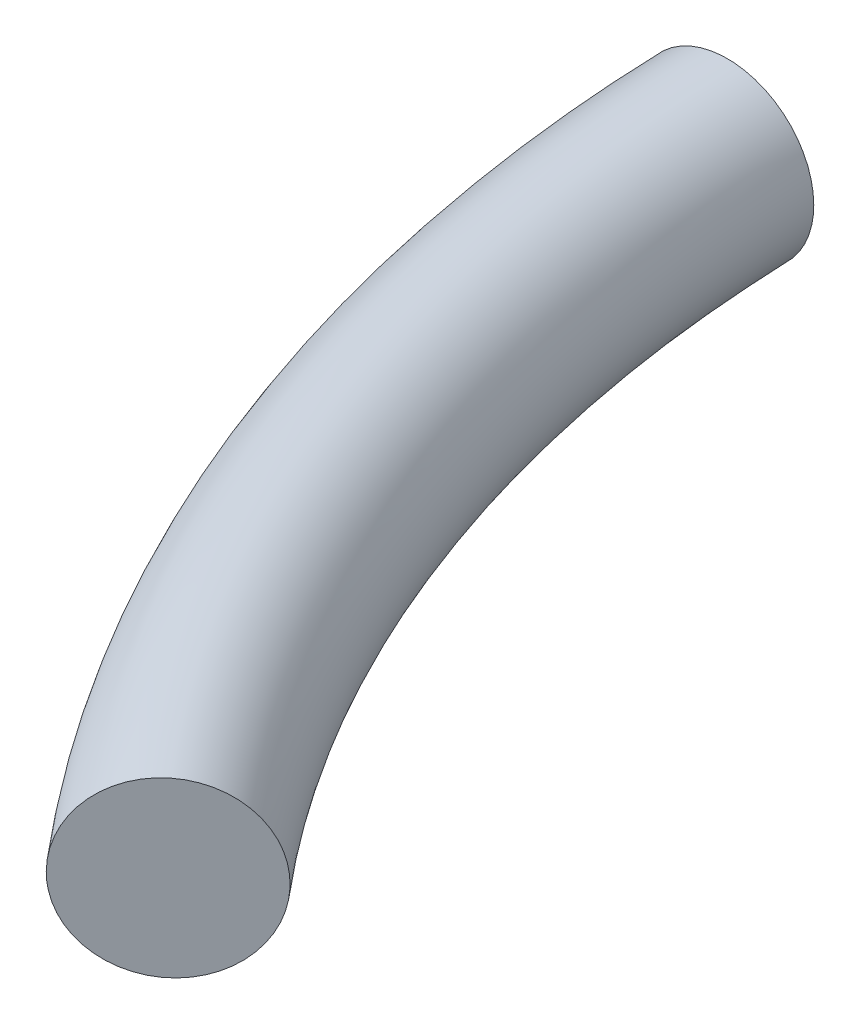
ISO-10303-21;
HEADER;
FILE_DESCRIPTION(('STEP AP214'),'2;1');
FILE_NAME('part.step','',(''),(''),'','','');
FILE_SCHEMA(('AUTOMOTIVE_DESIGN { 1 0 10303 214 1 1 1 1 }'));
ENDSEC;
DATA;
#1=APPLICATION_CONTEXT('core data for automotive mechanical design processes');
#2=APPLICATION_PROTOCOL_DEFINITION('international standard','automotive_design',2000,#1);
#3=PRODUCT_CONTEXT('',#1,'mechanical');
#4=PRODUCT('Part','Part','',(#3));
#5=PRODUCT_RELATED_PRODUCT_CATEGORY('part','',(#4));
#6=PRODUCT_DEFINITION_FORMATION('','',#4);
#7=PRODUCT_DEFINITION_CONTEXT('part definition',#1,'design');
#8=PRODUCT_DEFINITION('design','',#6,#7);
#9=PRODUCT_DEFINITION_SHAPE('','',#8);
#10=(LENGTH_UNIT() NAMED_UNIT(*) SI_UNIT(.MILLI.,.METRE.));
#11=(NAMED_UNIT(*) PLANE_ANGLE_UNIT() SI_UNIT($,.RADIAN.));
#12=(NAMED_UNIT(*) SI_UNIT($,.STERADIAN.) SOLID_ANGLE_UNIT());
#13=UNCERTAINTY_MEASURE_WITH_UNIT(LENGTH_MEASURE(1.E-05),#10,'distance_accuracy_value','');
#14=(GEOMETRIC_REPRESENTATION_CONTEXT(3) GLOBAL_UNCERTAINTY_ASSIGNED_CONTEXT((#13)) GLOBAL_UNIT_ASSIGNED_CONTEXT((#10,
#11,#12)) REPRESENTATION_CONTEXT('',''));
#15=CARTESIAN_POINT('',(0.,0.,0.));
#16=DIRECTION('',(0.,0.,1.));
#17=DIRECTION('',(1.,0.,0.));
#18=AXIS2_PLACEMENT_3D('',#15,#16,#17);
#19=CARTESIAN_POINT('',(0.,6.,0.));
#20=DIRECTION('',(0.642787609686505,0.,0.766044443119007));
#21=DIRECTION('',(0.766044443119007,0.,-0.642787609686505));
#22=AXIS2_PLACEMENT_3D('',#19,#20,#21);
#23=PLANE('',#22);
#24=CARTESIAN_POINT('',(-5.56314943222272,0.7302,4.66803663676176));
#25=CARTESIAN_POINT('',(-5.56314801835112,0.75265524155964,4.66803545038262));
#26=CARTESIAN_POINT('',(-5.56169559657985,0.775130857259379,4.66681672381004));
#27=CARTESIAN_POINT('',(-5.55591739134539,0.819482451297505,4.66196823392893));
#28=CARTESIAN_POINT('',(-5.55158545824048,0.841357041711003,4.65833331045832));
#29=CARTESIAN_POINT('',(-5.54017728754368,0.883809618347233,4.64876071863422));
#30=CARTESIAN_POINT('',(-5.53310594805307,0.904389843003348,4.64282716027573));
#31=CARTESIAN_POINT('',(-5.51640657955334,0.943737337222424,4.62881472632671));
#32=CARTESIAN_POINT('',(-5.50677492359407,0.962501982989582,4.62073280736366));
#33=CARTESIAN_POINT('',(-5.48524883923675,0.997627484938171,4.60267027791875));
#34=CARTESIAN_POINT('',(-5.47335762063846,1.01399169330263,4.59269236077867));
#35=CARTESIAN_POINT('',(-5.44762249830115,1.0439048849067,4.57109802911713));
#36=CARTESIAN_POINT('',(-5.43377588429877,1.05744989503907,4.55947934041469));
#37=CARTESIAN_POINT('',(-5.40454698224069,1.08130194187445,4.53495337947803));
#38=CARTESIAN_POINT('',(-5.38916582005334,1.0916113298001,4.52204705195956));
#39=CARTESIAN_POINT('',(-5.35729500603692,1.10871348302438,4.49530426367306));
#40=CARTESIAN_POINT('',(-5.34080528905904,1.11550604143746,4.4814677482387));
#41=CARTESIAN_POINT('',(-5.3071868157276,1.12538061292917,4.45325849966555));
#42=CARTESIAN_POINT('',(-5.29005807818154,1.12846273512374,4.43888578230812));
#43=CARTESIAN_POINT('',(-5.25564733500628,1.1308293161772,4.41001174040123));
#44=CARTESIAN_POINT('',(-5.23836532937709,1.13011377503607,4.39551041585177));
#45=CARTESIAN_POINT('',(-5.20413812474646,1.12490525493437,4.36679038106998));
#46=CARTESIAN_POINT('',(-5.18719293566527,1.12041216488209,4.35257167916173));
#47=CARTESIAN_POINT('',(-5.15412194121603,1.10777635092602,4.32482181991671));
#48=CARTESIAN_POINT('',(-5.13799608771281,1.09963384169881,4.31129062218973));
#49=CARTESIAN_POINT('',(-5.10700905643696,1.07992311451522,4.28528941567489));
#50=CARTESIAN_POINT('',(-5.09214880904155,1.06835240391896,4.27282018756621));
#51=CARTESIAN_POINT('',(-5.0641483327315,1.04213485030234,4.24932499822166));
#52=CARTESIAN_POINT('',(-5.05100572836706,1.02749233015651,4.23829704374674));
#53=CARTESIAN_POINT('',(-5.02677143143803,0.99551397474831,4.21796205413176));
#54=CARTESIAN_POINT('',(-5.01568266107474,0.97817436557765,4.20865747100972));
#55=CARTESIAN_POINT('',(-4.9959085162887,0.941335318357767,4.1920649934129));
#56=CARTESIAN_POINT('',(-4.9872197461931,0.921838987081608,4.1847742496303));
#57=CARTESIAN_POINT('',(-4.97245756828957,0.881186262625342,4.17238731159608));
#58=CARTESIAN_POINT('',(-4.96638885128787,0.860026971539701,4.16729505339823));
#59=CARTESIAN_POINT('',(-4.95707261308493,0.81671349003598,4.15947780135819));
#60=CARTESIAN_POINT('',(-4.95381908800493,0.794561523394872,4.15674776966353));
#61=CARTESIAN_POINT('',(-4.95087926015648,0.758269762147005,4.15428096120017));
#62=CARTESIAN_POINT('',(-4.9503129937847,0.744238862857464,4.15380580729646));
#63=CARTESIAN_POINT('',(-4.95031529159912,0.70774475844036,4.1538077353917));
#64=CARTESIAN_POINT('',(-4.95176771337039,0.685269142740621,4.15502646196428));
#65=CARTESIAN_POINT('',(-4.95754591860485,0.640917548702496,4.15987495184539));
#66=CARTESIAN_POINT('',(-4.96187785170976,0.619042958288997,4.163509875316));
#67=CARTESIAN_POINT('',(-4.97328602240656,0.576590381652767,4.17308246714009));
#68=CARTESIAN_POINT('',(-4.98035736189717,0.556010156996652,4.17901602549859));
#69=CARTESIAN_POINT('',(-4.9970567303969,0.516662662777576,4.19302845944761));
#70=CARTESIAN_POINT('',(-5.00668838635617,0.497898017010418,4.20111037841065));
#71=CARTESIAN_POINT('',(-5.02821447071349,0.46277251506183,4.21917290785557));
#72=CARTESIAN_POINT('',(-5.04010568931179,0.44640830669737,4.22915082499565));
#73=CARTESIAN_POINT('',(-5.06584081164909,0.416495115093302,4.25074515665718));
#74=CARTESIAN_POINT('',(-5.07968742565147,0.40295010496093,4.26236384535963));
#75=CARTESIAN_POINT('',(-5.10891632770956,0.379098058125553,4.28688980629628));
#76=CARTESIAN_POINT('',(-5.1242974898969,0.368788670199896,4.29979613381476));
#77=CARTESIAN_POINT('',(-5.15616830391332,0.351686516975622,4.32653892210126));
#78=CARTESIAN_POINT('',(-5.1726580208912,0.344893958562538,4.34037543753561));
#79=CARTESIAN_POINT('',(-5.20627649422264,0.335019387070832,4.36858468610877));
#80=CARTESIAN_POINT('',(-5.22340523176871,0.331937264876257,4.3829574034662));
#81=CARTESIAN_POINT('',(-5.25781597494396,0.329570683822803,4.41183144537309));
#82=CARTESIAN_POINT('',(-5.27509798057316,0.330286224963925,4.42633276992255));
#83=CARTESIAN_POINT('',(-5.30932518520378,0.335494745065634,4.45505280470433));
#84=CARTESIAN_POINT('',(-5.32627037428497,0.339987835117909,4.46927150661259));
#85=CARTESIAN_POINT('',(-5.35934136873421,0.352623649073977,4.49702136585761));
#86=CARTESIAN_POINT('',(-5.37546722223743,0.360766158301187,4.51055256358458));
#87=CARTESIAN_POINT('',(-5.40645425351329,0.380476885484782,4.53655377009943));
#88=CARTESIAN_POINT('',(-5.42131450090869,0.392047596081043,4.54902299820811));
#89=CARTESIAN_POINT('',(-5.44931497721874,0.418265149697662,4.57251818755266));
#90=CARTESIAN_POINT('',(-5.46245758158318,0.432907669843492,4.58354614202757));
#91=CARTESIAN_POINT('',(-5.48669187851221,0.46488602525169,4.60388113164256));
#92=CARTESIAN_POINT('',(-5.4977806488755,0.482225634422349,4.6131857147646));
#93=CARTESIAN_POINT('',(-5.51755479366154,0.519064681642232,4.62977819236142));
#94=CARTESIAN_POINT('',(-5.52624356375714,0.538561012918391,4.63706893614402));
#95=CARTESIAN_POINT('',(-5.54100574166067,0.579213737374656,4.64945587417824));
#96=CARTESIAN_POINT('',(-5.54707445866237,0.600373028460299,4.65454813237609));
#97=CARTESIAN_POINT('',(-5.55639069686531,0.64368650996402,4.66236538441613));
#98=CARTESIAN_POINT('',(-5.55964422194531,0.665838476605128,4.66509541611079));
#99=CARTESIAN_POINT('',(-5.56258404979376,0.702130237852995,4.66756222457415));
#100=CARTESIAN_POINT('',(-5.56315031616555,0.716161137142536,4.66803737847786));
#101=CARTESIAN_POINT('',(-5.56314943222272,0.7302,4.66803663676176));
#102=B_SPLINE_CURVE_WITH_KNOTS('',3,(#24,#25,#26,#27,#28,#29,#30,#31,#32,#33,#34,#35,#36,#37,
#38,#39,#40,#41,#42,#43,#44,#45,#46,#47,#48,#49,#50,#51,#52,#53,#54,#55,#56,#57,#58,#59,#60,#61,
#62,#63,#64,#65,#66,#67,#68,#69,#70,#71,#72,#73,#74,#75,#76,#77,#78,#79,#80,#81,#82,#83,#84,#85,
#86,#87,#88,#89,#90,#91,#92,#93,#94,#95,#96,#97,#98,#99,#100,#101),.UNSPECIFIED.,.T.,.F.,(4,2,2,
2,2,2,2,2,2,2,2,2,2,2,2,2,2,2,2,2,2,2,2,2,2,2,2,2,2,2,2,2,2,2,2,2,2,2,4),(0.,0.0673217190940752,
0.134787678055461,0.202133559490899,0.269575356418626,0.336922056232695,0.40436303479347,
0.471754892083667,0.539150713403565,0.606544552708821,0.673938392014079,0.741334213333976,
0.808726070624175,0.876167049184948,0.943513748999018,1.01095554592846,1.07830142736561,
1.14576738632871,1.2130891054245,1.25517818200736,1.32249990110144,1.38996586006282,
1.45731174149826,1.52475353842599,1.59210023824006,1.65954121680083,1.72693307409103,
1.79432889541093,1.86172273471618,1.92911657402144,1.99651239534134,2.06390425263154,
2.13134523119231,2.19869193100638,2.26613372793582,2.33347960937297,2.40094556833607,
2.46826728743186,2.51035636401472),.UNSPECIFIED.);
#103=CARTESIAN_POINT('',(-5.56314943222272,0.7302,4.66803663676176));
#104=VERTEX_POINT('',#103);
#105=EDGE_CURVE('E18',#104,#104,#102,.T.);
#106=ORIENTED_EDGE('',*,*,#105,.F.);
#107=EDGE_LOOP('',(#106));
#108=FACE_BOUND('',#107,.T.);
#109=ADVANCED_FACE('F14',(#108),#23,.T.);
#110=CARTESIAN_POINT('',(0.,6.,0.));
#111=DIRECTION('',(0.0348994967024999,0.,0.999390827019096));
#112=DIRECTION('',(0.999390827019096,0.,-0.0348994967024999));
#113=AXIS2_PLACEMENT_3D('',#110,#111,#112);
#114=PLANE('',#113);
#115=CARTESIAN_POINT('',(-6.45823923756032,0.7302,0.225526683737396));
#116=CARTESIAN_POINT('',(-6.45824108211428,0.75265524155964,0.225526748150638));
#117=CARTESIAN_POINT('',(-6.46013592908851,0.775130857259379,0.22559291766505));
#118=CARTESIAN_POINT('',(-6.46767424538311,0.819482451297505,0.22585616147073));
#119=CARTESIAN_POINT('',(-6.4733257376003,0.841357041711003,0.226053515927727));
#120=CARTESIAN_POINT('',(-6.48820897479347,0.883809618347233,0.226573250023041));
#121=CARTESIAN_POINT('',(-6.49743432964739,0.904389843003348,0.226895406513378));
#122=CARTESIAN_POINT('',(-6.51922052736159,0.943737337222424,0.227656197301856));
#123=CARTESIAN_POINT('',(-6.53178610198478,0.962501982989582,0.2280949968368));
#124=CARTESIAN_POINT('',(-6.55986929146756,0.997627484938171,0.229075683423321));
#125=CARTESIAN_POINT('',(-6.57538271878364,1.01399169330263,0.229617424242657));
#126=CARTESIAN_POINT('',(-6.60895707002024,1.0439048849067,0.230789866423026));
#127=CARTESIAN_POINT('',(-6.62702152978305,1.05744989503907,0.231420691258393));
#128=CARTESIAN_POINT('',(-6.66515390821498,1.08130194187445,0.232752303255786));
#129=CARTESIAN_POINT('',(-6.68522035806264,1.09161132980011,0.233453039125437));
#130=CARTESIAN_POINT('',(-6.72679940672456,1.10871348302438,0.234905011499447));
#131=CARTESIAN_POINT('',(-6.74831209053275,1.11550604143746,0.23565625097186));
#132=CARTESIAN_POINT('',(-6.79217115663214,1.12538061292917,0.23718784330924));
#133=CARTESIAN_POINT('',(-6.81451751438686,1.12846273512374,0.237968195317374));
#134=CARTESIAN_POINT('',(-6.85941018528757,1.1308293161772,0.239535881929766));
#135=CARTESIAN_POINT('',(-6.88195649843357,1.13011377503608,0.240323216534023));
#136=CARTESIAN_POINT('',(-6.92660972273355,1.12490525493437,0.241882541486866));
#137=CARTESIAN_POINT('',(-6.94871662094549,1.12041216488209,0.242654531383505));
#138=CARTESIAN_POINT('',(-6.99186143948682,1.10777635092602,0.244161181646551));
#139=CARTESIAN_POINT('',(-7.01289942261396,1.09963384169881,0.244895844205904));
#140=CARTESIAN_POINT('',(-7.05332547764486,1.07992311451522,0.246307553155098));
#141=CARTESIAN_POINT('',(-7.07271233576725,1.06835240391895,0.246984557158762));
#142=CARTESIAN_POINT('',(-7.1092420951406,1.04213485030234,0.248260204465426));
#143=CARTESIAN_POINT('',(-7.12638809543203,1.02749233015651,0.248858955989305));
#144=CARTESIAN_POINT('',(-7.1580044517253,0.995513974748309,0.249963023479592));
#145=CARTESIAN_POINT('',(-7.17247099538805,0.978174365577649,0.250468206316185));
#146=CARTESIAN_POINT('',(-7.19826858335939,0.941335318357766,0.251369077939174));
#147=CARTESIAN_POINT('',(-7.20960405770376,0.921838987081608,0.251764921425829));
#148=CARTESIAN_POINT('',(-7.22886297318331,0.881186262625343,0.252437457573951));
#149=CARTESIAN_POINT('',(-7.23678029463607,0.8600269715397,0.252713936531399));
#150=CARTESIAN_POINT('',(-7.24893437144712,0.816713490035979,0.253138366246105));
#151=CARTESIAN_POINT('',(-7.2531789595381,0.794561523394871,0.253286590528417));
#152=CARTESIAN_POINT('',(-7.25701429443434,0.758269762147004,0.253420523374249));
#153=CARTESIAN_POINT('',(-7.25775305237807,0.744238862857464,0.253446321370112));
#154=CARTESIAN_POINT('',(-7.25775005462163,0.70774475844036,0.25344621668615));
#155=CARTESIAN_POINT('',(-7.25585520764741,0.685269142740622,0.253380047171744));
#156=CARTESIAN_POINT('',(-7.2483168913528,0.640917548702496,0.253116803366065));
#157=CARTESIAN_POINT('',(-7.24266539913562,0.619042958288997,0.252919448909062));
#158=CARTESIAN_POINT('',(-7.22778216194244,0.576590381652767,0.252399714813748));
#159=CARTESIAN_POINT('',(-7.21855680708852,0.556010156996652,0.252077558323417));
#160=CARTESIAN_POINT('',(-7.19677060937433,0.516662662777576,0.251316767534938));
#161=CARTESIAN_POINT('',(-7.18420503475114,0.497898017010418,0.250877967999987));
#162=CARTESIAN_POINT('',(-7.15612184526835,0.46277251506183,0.249897281413466));
#163=CARTESIAN_POINT('',(-7.14060841795227,0.44640830669737,0.249355540594137));
#164=CARTESIAN_POINT('',(-7.10703406671568,0.416495115093302,0.248183098413769));
#165=CARTESIAN_POINT('',(-7.08896960695286,0.40295010496093,0.247552273578396));
#166=CARTESIAN_POINT('',(-7.05083722852094,0.379098058125553,0.246220661581003));
#167=CARTESIAN_POINT('',(-7.03077077867327,0.368788670199896,0.245519925711358));
#168=CARTESIAN_POINT('',(-6.98919173001136,0.351686516975622,0.244067953337348));
#169=CARTESIAN_POINT('',(-6.96767904620317,0.344893958562539,0.243316713864929));
#170=CARTESIAN_POINT('',(-6.92381998010378,0.335019387070832,0.241785121527549));
#171=CARTESIAN_POINT('',(-6.90147362234906,0.331937264876257,0.24100476951942));
#172=CARTESIAN_POINT('',(-6.85658095144834,0.329570683822803,0.239437082907029));
#173=CARTESIAN_POINT('',(-6.83403463830235,0.330286224963925,0.238649748302767));
#174=CARTESIAN_POINT('',(-6.78938141400236,0.335494745065634,0.237090423349923));
#175=CARTESIAN_POINT('',(-6.76727451579043,0.339987835117908,0.236318433453288));
#176=CARTESIAN_POINT('',(-6.7241296972491,0.352623649073976,0.234811783190244));
#177=CARTESIAN_POINT('',(-6.70309171412196,0.360766158301186,0.234077120630889));
#178=CARTESIAN_POINT('',(-6.66266565909106,0.380476885484781,0.232665411681694));
#179=CARTESIAN_POINT('',(-6.64327880096867,0.392047596081043,0.231988407678034));
#180=CARTESIAN_POINT('',(-6.60674904159532,0.418265149697661,0.230712760371367));
#181=CARTESIAN_POINT('',(-6.58960304130388,0.432907669843492,0.230114008847482));
#182=CARTESIAN_POINT('',(-6.55798668501061,0.464886025251689,0.229009941357195));
#183=CARTESIAN_POINT('',(-6.54352014134786,0.482225634422348,0.228504758520608));
#184=CARTESIAN_POINT('',(-6.51772255337652,0.519064681642232,0.227603886897622));
#185=CARTESIAN_POINT('',(-6.50638707903216,0.538561012918391,0.227208043410966));
#186=CARTESIAN_POINT('',(-6.4871281635526,0.579213737374657,0.226535507262842));
#187=CARTESIAN_POINT('',(-6.47921084209984,0.600373028460299,0.226259028305394));
#188=CARTESIAN_POINT('',(-6.4670567652888,0.643686509964019,0.22583459859069));
#189=CARTESIAN_POINT('',(-6.46281217719781,0.665838476605128,0.225686374308382));
#190=CARTESIAN_POINT('',(-6.45897684230158,0.702130237852995,0.225552441462545));
#191=CARTESIAN_POINT('',(-6.45823808435784,0.716161137142536,0.225526643466679));
#192=CARTESIAN_POINT('',(-6.45823923756032,0.7302,0.225526683737396));
#193=B_SPLINE_CURVE_WITH_KNOTS('',3,(#115,#116,#117,#118,#119,#120,#121,#122,#123,#124,#125,
#126,#127,#128,#129,#130,#131,#132,#133,#134,#135,#136,#137,#138,#139,#140,#141,#142,#143,#144,
#145,#146,#147,#148,#149,#150,#151,#152,#153,#154,#155,#156,#157,#158,#159,#160,#161,#162,#163,
#164,#165,#166,#167,#168,#169,#170,#171,#172,#173,#174,#175,#176,#177,#178,#179,#180,#181,#182,
#183,#184,#185,#186,#187,#188,#189,#190,#191,#192),.UNSPECIFIED.,.T.,.F.,(4,2,2,2,2,2,2,2,2,2,2,
2,2,2,2,2,2,2,2,2,2,2,2,2,2,2,2,2,2,2,2,2,2,2,2,2,2,2,4),(0.,0.0673217190940753,
0.134787678055461,0.202133559490899,0.269575356418626,0.336922056232696,0.404363034793471,
0.471754892083668,0.539150713403566,0.606544552708822,0.673938392014079,0.741334213333978,
0.808726070624175,0.876167049184951,0.943513748999021,1.01095554592846,1.07830142736561,
1.14576738632871,1.2130891054245,1.25517818200736,1.32249990110144,1.38996586006282,
1.45731174149826,1.52475353842599,1.59210023824006,1.65954121680083,1.72693307409103,
1.79432889541093,1.86172273471618,1.92911657402144,1.99651239534134,2.06390425263153,
2.13134523119231,2.19869193100638,2.26613372793582,2.33347960937297,2.40094556833608,
2.46826728743186,2.51035636401472),.UNSPECIFIED.);
#194=CARTESIAN_POINT('',(-6.45823923756032,0.7302,0.225526683737396));
#195=VERTEX_POINT('',#194);
#196=EDGE_CURVE('E10',#195,#195,#193,.T.);
#197=ORIENTED_EDGE('',*,*,#196,.F.);
#198=EDGE_LOOP('',(#197));
#199=FACE_BOUND('',#198,.T.);
#200=ADVANCED_FACE('F34',(#199),#114,.F.);
#201=CARTESIAN_POINT('',(0.,0.7302,0.));
#202=DIRECTION('',(0.,-1.,0.));
#203=DIRECTION('',(0.642787609686505,0.,0.766044443119007));
#204=AXIS2_PLACEMENT_3D('',#201,#202,#203);
#205=TOROIDAL_SURFACE('',#204,6.862175820468,0.4);
#206=ORIENTED_EDGE('',*,*,#196,.T.);
#207=EDGE_LOOP('',(#206));
#208=FACE_BOUND('',#207,.T.);
#209=ORIENTED_EDGE('',*,*,#105,.T.);
#210=EDGE_LOOP('',(#209));
#211=FACE_BOUND('',#210,.T.);
#212=ADVANCED_FACE('F36',(#208,#211),#205,.T.);
#213=CLOSED_SHELL('',(#109,#200,#212));
#214=MANIFOLD_SOLID_BREP('B1',#213);
#215=ADVANCED_BREP_SHAPE_REPRESENTATION('',(#18,#214),#14);
#216=SHAPE_DEFINITION_REPRESENTATION(#9,#215);
ENDSEC;
END-ISO-10303-21;
